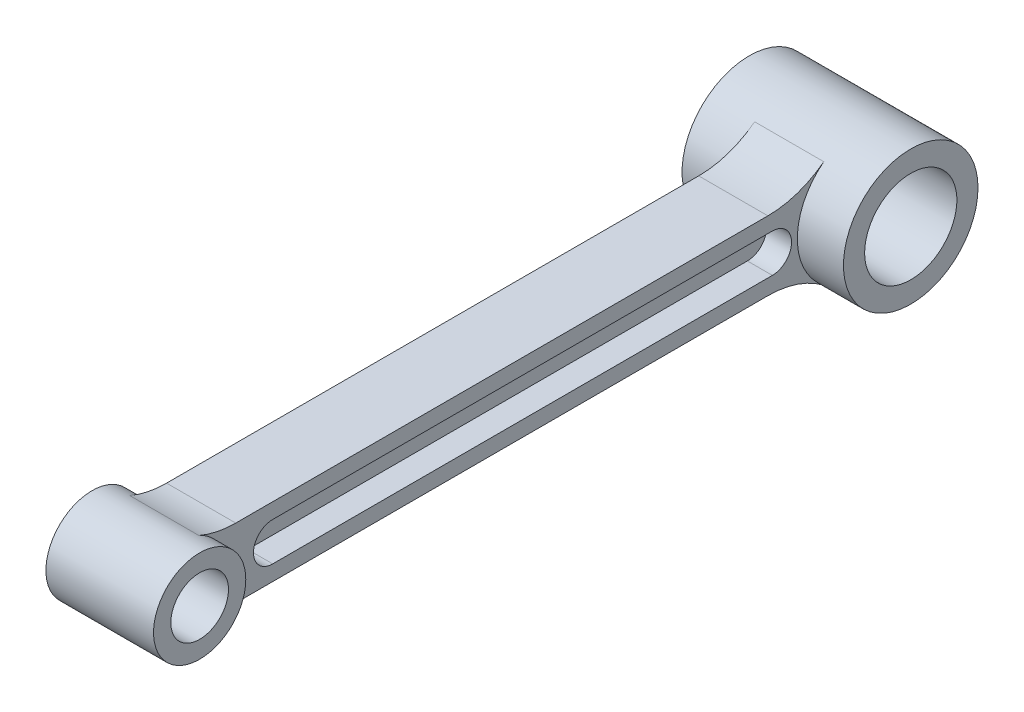
ISO-10303-21;
HEADER;
FILE_DESCRIPTION(('STEP AP214'),'2;1');
FILE_NAME('part.step','',(''),(''),'','','');
FILE_SCHEMA(('AUTOMOTIVE_DESIGN { 1 0 10303 214 1 1 1 1 }'));
ENDSEC;
DATA;
#1=APPLICATION_CONTEXT('core data for automotive mechanical design processes');
#2=APPLICATION_PROTOCOL_DEFINITION('international standard','automotive_design',2000,#1);
#3=PRODUCT_CONTEXT('',#1,'mechanical');
#4=PRODUCT('Part','Part','',(#3));
#5=PRODUCT_RELATED_PRODUCT_CATEGORY('part','',(#4));
#6=PRODUCT_DEFINITION_FORMATION('','',#4);
#7=PRODUCT_DEFINITION_CONTEXT('part definition',#1,'design');
#8=PRODUCT_DEFINITION('design','',#6,#7);
#9=PRODUCT_DEFINITION_SHAPE('','',#8);
#10=(LENGTH_UNIT() NAMED_UNIT(*) SI_UNIT(.MILLI.,.METRE.));
#11=(NAMED_UNIT(*) PLANE_ANGLE_UNIT() SI_UNIT($,.RADIAN.));
#12=(NAMED_UNIT(*) SI_UNIT($,.STERADIAN.) SOLID_ANGLE_UNIT());
#13=UNCERTAINTY_MEASURE_WITH_UNIT(LENGTH_MEASURE(1.E-05),#10,'distance_accuracy_value','');
#14=(GEOMETRIC_REPRESENTATION_CONTEXT(3) GLOBAL_UNCERTAINTY_ASSIGNED_CONTEXT((#13)) GLOBAL_UNIT_ASSIGNED_CONTEXT((#10,
#11,#12)) REPRESENTATION_CONTEXT('',''));
#15=CARTESIAN_POINT('',(0.,0.,0.));
#16=DIRECTION('',(0.,0.,1.));
#17=DIRECTION('',(1.,0.,0.));
#18=AXIS2_PLACEMENT_3D('',#15,#16,#17);
#19=CARTESIAN_POINT('',(2.5,0.,0.));
#20=DIRECTION('',(1.,0.,0.));
#21=DIRECTION('',(0.,0.,-1.));
#22=AXIS2_PLACEMENT_3D('',#19,#20,#21);
#23=PLANE('',#22);
#24=DIRECTION('',(0.,0.,-1.));
#25=VECTOR('',#24,1.);
#26=CARTESIAN_POINT('',(2.5,-5.,0.));
#27=LINE('',#26,#25);
#28=CARTESIAN_POINT('',(2.5,-5.,0.));
#29=VERTEX_POINT('',#28);
#30=CARTESIAN_POINT('',(2.5,-5.,-130.));
#31=VERTEX_POINT('',#30);
#32=EDGE_CURVE('E245',#29,#31,#27,.T.);
#33=ORIENTED_EDGE('',*,*,#32,.T.);
#34=CARTESIAN_POINT('',(2.5,0.,-130.));
#35=DIRECTION('',(1.,0.,0.));
#36=DIRECTION('',(0.,0.,-1.));
#37=AXIS2_PLACEMENT_3D('',#34,#35,#36);
#38=CIRCLE('',#37,5.);
#39=CARTESIAN_POINT('',(2.5,5.,-130.));
#40=VERTEX_POINT('',#39);
#41=EDGE_CURVE('E248',#31,#40,#38,.T.);
#42=ORIENTED_EDGE('',*,*,#41,.T.);
#43=DIRECTION('',(0.,0.,-1.));
#44=VECTOR('',#43,1.);
#45=CARTESIAN_POINT('',(2.5,5.,0.));
#46=LINE('',#45,#44);
#47=CARTESIAN_POINT('',(2.5,5.,0.));
#48=VERTEX_POINT('',#47);
#49=EDGE_CURVE('E50',#48,#40,#46,.T.);
#50=ORIENTED_EDGE('',*,*,#49,.F.);
#51=CARTESIAN_POINT('',(2.5,0.,0.));
#52=DIRECTION('',(1.,0.,0.));
#53=DIRECTION('',(0.,0.,-1.));
#54=AXIS2_PLACEMENT_3D('',#51,#52,#53);
#55=CIRCLE('',#54,5.);
#56=EDGE_CURVE('E11',#48,#29,#55,.T.);
#57=ORIENTED_EDGE('',*,*,#56,.T.);
#58=EDGE_LOOP('',(#33,#42,#50,#57));
#59=FACE_BOUND('',#58,.T.);
#60=ADVANCED_FACE('F39',(#59),#23,.T.);
#61=CARTESIAN_POINT('',(9.,0.,-130.));
#62=DIRECTION('',(-1.,0.,0.));
#63=DIRECTION('',(0.,0.,1.));
#64=AXIS2_PLACEMENT_3D('',#61,#62,#63);
#65=CYLINDRICAL_SURFACE('',#64,5.);
#66=CARTESIAN_POINT('',(-2.5,0.,-130.));
#67=DIRECTION('',(1.,0.,0.));
#68=DIRECTION('',(0.,0.,-1.));
#69=AXIS2_PLACEMENT_3D('',#66,#67,#68);
#70=CIRCLE('',#69,5.);
#71=CARTESIAN_POINT('',(-2.5,-5.,-130.));
#72=VERTEX_POINT('',#71);
#73=CARTESIAN_POINT('',(-2.5,5.,-130.));
#74=VERTEX_POINT('',#73);
#75=EDGE_CURVE('E256',#72,#74,#70,.T.);
#76=ORIENTED_EDGE('',*,*,#75,.T.);
#77=DIRECTION('',(-1.,0.,0.));
#78=VECTOR('',#77,1.);
#79=CARTESIAN_POINT('',(9.,5.,-130.));
#80=LINE('',#79,#78);
#81=CARTESIAN_POINT('',(-9.,5.,-130.));
#82=VERTEX_POINT('',#81);
#83=EDGE_CURVE('E231',#74,#82,#80,.T.);
#84=ORIENTED_EDGE('',*,*,#83,.T.);
#85=CARTESIAN_POINT('',(-9.,0.,-130.));
#86=DIRECTION('',(1.,0.,0.));
#87=DIRECTION('',(0.,0.,-1.));
#88=AXIS2_PLACEMENT_3D('',#85,#86,#87);
#89=CIRCLE('',#88,5.);
#90=CARTESIAN_POINT('',(-9.,-5.,-130.));
#91=VERTEX_POINT('',#90);
#92=EDGE_CURVE('E303',#91,#82,#89,.T.);
#93=ORIENTED_EDGE('',*,*,#92,.F.);
#94=DIRECTION('',(-1.,0.,0.));
#95=VECTOR('',#94,1.);
#96=CARTESIAN_POINT('',(9.,-5.,-130.));
#97=LINE('',#96,#95);
#98=EDGE_CURVE('E241',#72,#91,#97,.T.);
#99=ORIENTED_EDGE('',*,*,#98,.F.);
#100=EDGE_LOOP('',(#76,#84,#93,#99));
#101=FACE_BOUND('',#100,.T.);
#102=ADVANCED_FACE('F281',(#101),#65,.F.);
#103=CARTESIAN_POINT('',(9.,-5.,0.));
#104=DIRECTION('',(0.,1.,0.));
#105=DIRECTION('',(0.,0.,1.));
#106=AXIS2_PLACEMENT_3D('',#103,#104,#105);
#107=PLANE('',#106);
#108=DIRECTION('',(0.,0.,-1.));
#109=VECTOR('',#108,1.);
#110=CARTESIAN_POINT('',(-2.5,-5.,0.));
#111=LINE('',#110,#109);
#112=CARTESIAN_POINT('',(-2.5,-5.,0.));
#113=VERTEX_POINT('',#112);
#114=EDGE_CURVE('E171',#113,#72,#111,.T.);
#115=ORIENTED_EDGE('',*,*,#114,.T.);
#116=ORIENTED_EDGE('',*,*,#98,.T.);
#117=DIRECTION('',(0.,0.,-1.));
#118=VECTOR('',#117,1.);
#119=CARTESIAN_POINT('',(-9.,-5.,0.));
#120=LINE('',#119,#118);
#121=CARTESIAN_POINT('',(-9.,-5.,0.));
#122=VERTEX_POINT('',#121);
#123=EDGE_CURVE('E277',#122,#91,#120,.T.);
#124=ORIENTED_EDGE('',*,*,#123,.F.);
#125=DIRECTION('',(-1.,0.,0.));
#126=VECTOR('',#125,1.);
#127=CARTESIAN_POINT('',(9.,-5.,0.));
#128=LINE('',#127,#126);
#129=EDGE_CURVE('E236',#113,#122,#128,.T.);
#130=ORIENTED_EDGE('',*,*,#129,.F.);
#131=EDGE_LOOP('',(#115,#116,#124,#130));
#132=FACE_BOUND('',#131,.T.);
#133=ADVANCED_FACE('F274',(#132),#107,.T.);
#134=CARTESIAN_POINT('',(9.,0.,0.));
#135=DIRECTION('',(-1.,0.,0.));
#136=DIRECTION('',(0.,0.,1.));
#137=AXIS2_PLACEMENT_3D('',#134,#135,#136);
#138=CYLINDRICAL_SURFACE('',#137,5.);
#139=CARTESIAN_POINT('',(-2.5,0.,0.));
#140=DIRECTION('',(1.,0.,0.));
#141=DIRECTION('',(0.,0.,-1.));
#142=AXIS2_PLACEMENT_3D('',#139,#140,#141);
#143=CIRCLE('',#142,5.);
#144=CARTESIAN_POINT('',(-2.5,5.,0.));
#145=VERTEX_POINT('',#144);
#146=EDGE_CURVE('E43',#145,#113,#143,.T.);
#147=ORIENTED_EDGE('',*,*,#146,.T.);
#148=ORIENTED_EDGE('',*,*,#129,.T.);
#149=CARTESIAN_POINT('',(-9.,0.,0.));
#150=DIRECTION('',(1.,0.,0.));
#151=DIRECTION('',(0.,0.,-1.));
#152=AXIS2_PLACEMENT_3D('',#149,#150,#151);
#153=CIRCLE('',#152,5.);
#154=CARTESIAN_POINT('',(-9.,5.,0.));
#155=VERTEX_POINT('',#154);
#156=EDGE_CURVE('E309',#155,#122,#153,.T.);
#157=ORIENTED_EDGE('',*,*,#156,.F.);
#158=DIRECTION('',(-1.,0.,0.));
#159=VECTOR('',#158,1.);
#160=CARTESIAN_POINT('',(9.,5.,0.));
#161=LINE('',#160,#159);
#162=EDGE_CURVE('E230',#145,#155,#161,.T.);
#163=ORIENTED_EDGE('',*,*,#162,.F.);
#164=EDGE_LOOP('',(#147,#148,#157,#163));
#165=FACE_BOUND('',#164,.T.);
#166=ADVANCED_FACE('F269',(#165),#138,.F.);
#167=CARTESIAN_POINT('',(9.,5.,0.));
#168=DIRECTION('',(0.,1.,0.));
#169=DIRECTION('',(0.,0.,1.));
#170=AXIS2_PLACEMENT_3D('',#167,#168,#169);
#171=PLANE('',#170);
#172=ORIENTED_EDGE('',*,*,#83,.F.);
#173=DIRECTION('',(0.,0.,-1.));
#174=VECTOR('',#173,1.);
#175=CARTESIAN_POINT('',(-2.5,5.,0.));
#176=LINE('',#175,#174);
#177=EDGE_CURVE('E259',#145,#74,#176,.T.);
#178=ORIENTED_EDGE('',*,*,#177,.F.);
#179=ORIENTED_EDGE('',*,*,#162,.T.);
#180=DIRECTION('',(0.,0.,-1.));
#181=VECTOR('',#180,1.);
#182=CARTESIAN_POINT('',(-9.,5.,0.));
#183=LINE('',#182,#181);
#184=EDGE_CURVE('E161',#155,#82,#183,.T.);
#185=ORIENTED_EDGE('',*,*,#184,.T.);
#186=EDGE_LOOP('',(#172,#178,#179,#185));
#187=FACE_BOUND('',#186,.T.);
#188=ADVANCED_FACE('F286',(#187),#171,.F.);
#189=CARTESIAN_POINT('',(9.,-33.,9.61250543006183));
#190=DIRECTION('',(-1.,0.,0.));
#191=DIRECTION('',(0.,0.,1.));
#192=AXIS2_PLACEMENT_3D('',#189,#190,#191);
#193=CYLINDRICAL_SURFACE('',#192,24.);
#194=CARTESIAN_POINT('',(-9.,-33.,9.61250543006183));
#195=DIRECTION('',(1.,0.,0.));
#196=DIRECTION('',(0.,0.,-1.));
#197=AXIS2_PLACEMENT_3D('',#194,#195,#196);
#198=CIRCLE('',#197,24.);
#199=CARTESIAN_POINT('',(-9.,-11.,19.2041684766873));
#200=VERTEX_POINT('',#199);
#201=CARTESIAN_POINT('',(-9.,-9.,9.61250543006183));
#202=VERTEX_POINT('',#201);
#203=EDGE_CURVE('E160',#200,#202,#198,.F.);
#204=ORIENTED_EDGE('',*,*,#203,.T.);
#205=DIRECTION('',(-1.,0.,0.));
#206=VECTOR('',#205,1.);
#207=CARTESIAN_POINT('',(9.,-9.,9.61250543006183));
#208=LINE('',#207,#206);
#209=CARTESIAN_POINT('',(9.,-9.,9.61250543006183));
#210=VERTEX_POINT('',#209);
#211=EDGE_CURVE('E172',#210,#202,#208,.T.);
#212=ORIENTED_EDGE('',*,*,#211,.F.);
#213=CARTESIAN_POINT('',(9.,-33.,9.61250543006183));
#214=DIRECTION('',(1.,0.,0.));
#215=DIRECTION('',(0.,0.,-1.));
#216=AXIS2_PLACEMENT_3D('',#213,#214,#215);
#217=CIRCLE('',#216,24.);
#218=CARTESIAN_POINT('',(9.,-11.,19.2041684766873));
#219=VERTEX_POINT('',#218);
#220=EDGE_CURVE('E168',#219,#210,#217,.F.);
#221=ORIENTED_EDGE('',*,*,#220,.F.);
#222=DIRECTION('',(-1.,0.,0.));
#223=VECTOR('',#222,1.);
#224=CARTESIAN_POINT('',(9.,-11.,19.2041684766873));
#225=LINE('',#224,#223);
#226=EDGE_CURVE('E151',#219,#200,#225,.T.);
#227=ORIENTED_EDGE('',*,*,#226,.T.);
#228=EDGE_LOOP('',(#204,#212,#221,#227));
#229=FACE_BOUND('',#228,.T.);
#230=ADVANCED_FACE('F165',(#229),#193,.F.);
#231=CARTESIAN_POINT('',(9.,-9.,0.));
#232=DIRECTION('',(0.,1.,0.));
#233=DIRECTION('',(0.,0.,1.));
#234=AXIS2_PLACEMENT_3D('',#231,#232,#233);
#235=PLANE('',#234);
#236=DIRECTION('',(0.,0.,-1.));
#237=VECTOR('',#236,1.);
#238=CARTESIAN_POINT('',(-9.,-9.,0.));
#239=LINE('',#238,#237);
#240=CARTESIAN_POINT('',(-9.,-9.,-128.835540935677));
#241=VERTEX_POINT('',#240);
#242=EDGE_CURVE('E176',#202,#241,#239,.T.);
#243=ORIENTED_EDGE('',*,*,#242,.T.);
#244=DIRECTION('',(-1.,0.,0.));
#245=VECTOR('',#244,1.);
#246=CARTESIAN_POINT('',(9.,-9.,-128.835540935677));
#247=LINE('',#246,#245);
#248=CARTESIAN_POINT('',(9.,-9.,-128.835540935677));
#249=VERTEX_POINT('',#248);
#250=EDGE_CURVE('E220',#249,#241,#247,.T.);
#251=ORIENTED_EDGE('',*,*,#250,.F.);
#252=DIRECTION('',(0.,0.,-1.));
#253=VECTOR('',#252,1.);
#254=CARTESIAN_POINT('',(9.,-9.,0.));
#255=LINE('',#254,#253);
#256=EDGE_CURVE('E365',#210,#249,#255,.T.);
#257=ORIENTED_EDGE('',*,*,#256,.F.);
#258=ORIENTED_EDGE('',*,*,#211,.T.);
#259=EDGE_LOOP('',(#243,#251,#257,#258));
#260=FACE_BOUND('',#259,.T.);
#261=ADVANCED_FACE('F397',(#260),#235,.F.);
#262=CARTESIAN_POINT('',(9.,-33.,-128.835540935677));
#263=DIRECTION('',(-1.,0.,0.));
#264=DIRECTION('',(0.,0.,1.));
#265=AXIS2_PLACEMENT_3D('',#262,#263,#264);
#266=CYLINDRICAL_SURFACE('',#265,24.);
#267=CARTESIAN_POINT('',(-9.,-33.,-128.835540935677));
#268=DIRECTION('',(1.,0.,0.));
#269=DIRECTION('',(0.,0.,-1.));
#270=AXIS2_PLACEMENT_3D('',#267,#268,#269);
#271=CIRCLE('',#270,24.);
#272=CARTESIAN_POINT('',(-9.,-13.9156626506024,-143.388481117454));
#273=VERTEX_POINT('',#272);
#274=EDGE_CURVE('E181',#241,#273,#271,.F.);
#275=ORIENTED_EDGE('',*,*,#274,.T.);
#276=DIRECTION('',(-1.,0.,0.));
#277=VECTOR('',#276,1.);
#278=CARTESIAN_POINT('',(9.,-13.9156626506024,-143.388481117454));
#279=LINE('',#278,#277);
#280=CARTESIAN_POINT('',(9.,-13.9156626506024,-143.388481117454));
#281=VERTEX_POINT('',#280);
#282=EDGE_CURVE('E217',#281,#273,#279,.T.);
#283=ORIENTED_EDGE('',*,*,#282,.F.);
#284=CARTESIAN_POINT('',(9.,-33.,-128.835540935677));
#285=DIRECTION('',(1.,0.,0.));
#286=DIRECTION('',(0.,0.,-1.));
#287=AXIS2_PLACEMENT_3D('',#284,#285,#286);
#288=CIRCLE('',#287,24.);
#289=EDGE_CURVE('E369',#249,#281,#288,.F.);
#290=ORIENTED_EDGE('',*,*,#289,.F.);
#291=ORIENTED_EDGE('',*,*,#250,.T.);
#292=EDGE_LOOP('',(#275,#283,#290,#291));
#293=FACE_BOUND('',#292,.T.);
#294=ADVANCED_FACE('F394',(#293),#266,.F.);
#295=CARTESIAN_POINT('',(9.,33.,-128.835540935677));
#296=DIRECTION('',(-1.,0.,0.));
#297=DIRECTION('',(0.,0.,1.));
#298=AXIS2_PLACEMENT_3D('',#295,#296,#297);
#299=CYLINDRICAL_SURFACE('',#298,24.);
#300=CARTESIAN_POINT('',(-9.,33.,-128.835540935677));
#301=DIRECTION('',(1.,0.,0.));
#302=DIRECTION('',(0.,0.,-1.));
#303=AXIS2_PLACEMENT_3D('',#300,#301,#302);
#304=CIRCLE('',#303,24.);
#305=CARTESIAN_POINT('',(-9.,9.00000000000001,-128.835540935677));
#306=VERTEX_POINT('',#305);
#307=CARTESIAN_POINT('',(-9.,13.9156626506024,-143.388481117454));
#308=VERTEX_POINT('',#307);
#309=EDGE_CURVE('E192',#306,#308,#304,.T.);
#310=ORIENTED_EDGE('',*,*,#309,.F.);
#311=DIRECTION('',(-1.,0.,0.));
#312=VECTOR('',#311,1.);
#313=CARTESIAN_POINT('',(9.,9.00000000000001,-128.835540935677));
#314=LINE('',#313,#312);
#315=CARTESIAN_POINT('',(9.,9.00000000000001,-128.835540935677));
#316=VERTEX_POINT('',#315);
#317=EDGE_CURVE('E210',#316,#306,#314,.T.);
#318=ORIENTED_EDGE('',*,*,#317,.F.);
#319=CARTESIAN_POINT('',(9.,33.,-128.835540935677));
#320=DIRECTION('',(1.,0.,0.));
#321=DIRECTION('',(0.,0.,-1.));
#322=AXIS2_PLACEMENT_3D('',#319,#320,#321);
#323=CIRCLE('',#322,24.);
#324=CARTESIAN_POINT('',(9.,13.9156626506024,-143.388481117454));
#325=VERTEX_POINT('',#324);
#326=EDGE_CURVE('E299',#316,#325,#323,.T.);
#327=ORIENTED_EDGE('',*,*,#326,.T.);
#328=DIRECTION('',(-1.,0.,0.));
#329=VECTOR('',#328,1.);
#330=CARTESIAN_POINT('',(9.,13.9156626506024,-143.388481117454));
#331=LINE('',#330,#329);
#332=EDGE_CURVE('E213',#325,#308,#331,.T.);
#333=ORIENTED_EDGE('',*,*,#332,.T.);
#334=EDGE_LOOP('',(#310,#318,#327,#333));
#335=FACE_BOUND('',#334,.T.);
#336=ADVANCED_FACE('F380',(#335),#299,.F.);
#337=CARTESIAN_POINT('',(9.,9.,0.));
#338=DIRECTION('',(0.,1.,0.));
#339=DIRECTION('',(0.,0.,1.));
#340=AXIS2_PLACEMENT_3D('',#337,#338,#339);
#341=PLANE('',#340);
#342=DIRECTION('',(0.,0.,-1.));
#343=VECTOR('',#342,1.);
#344=CARTESIAN_POINT('',(-9.,9.,0.));
#345=LINE('',#344,#343);
#346=CARTESIAN_POINT('',(-9.,9.,9.61250543006183));
#347=VERTEX_POINT('',#346);
#348=EDGE_CURVE('E196',#347,#306,#345,.T.);
#349=ORIENTED_EDGE('',*,*,#348,.F.);
#350=DIRECTION('',(-1.,0.,0.));
#351=VECTOR('',#350,1.);
#352=CARTESIAN_POINT('',(9.,9.,9.61250543006183));
#353=LINE('',#352,#351);
#354=CARTESIAN_POINT('',(9.,9.,9.61250543006183));
#355=VERTEX_POINT('',#354);
#356=EDGE_CURVE('E206',#355,#347,#353,.T.);
#357=ORIENTED_EDGE('',*,*,#356,.F.);
#358=DIRECTION('',(0.,0.,-1.));
#359=VECTOR('',#358,1.);
#360=CARTESIAN_POINT('',(9.,9.,0.));
#361=LINE('',#360,#359);
#362=EDGE_CURVE('E293',#355,#316,#361,.T.);
#363=ORIENTED_EDGE('',*,*,#362,.T.);
#364=ORIENTED_EDGE('',*,*,#317,.T.);
#365=EDGE_LOOP('',(#349,#357,#363,#364));
#366=FACE_BOUND('',#365,.T.);
#367=ADVANCED_FACE('F387',(#366),#341,.T.);
#368=CARTESIAN_POINT('',(9.,5.,-130.));
#369=VERTEX_POINT('',#368);
#370=EDGE_CURVE('E226',#369,#40,#80,.T.);
#371=ORIENTED_EDGE('',*,*,#370,.T.);
#372=ORIENTED_EDGE('',*,*,#41,.F.);
#373=CARTESIAN_POINT('',(9.,-5.,-130.));
#374=VERTEX_POINT('',#373);
#375=EDGE_CURVE('E207',#374,#31,#97,.T.);
#376=ORIENTED_EDGE('',*,*,#375,.F.);
#377=CARTESIAN_POINT('',(9.,0.,-130.));
#378=DIRECTION('',(1.,0.,0.));
#379=DIRECTION('',(0.,0.,-1.));
#380=AXIS2_PLACEMENT_3D('',#377,#378,#379);
#381=CIRCLE('',#380,5.);
#382=EDGE_CURVE('E203',#374,#369,#381,.T.);
#383=ORIENTED_EDGE('',*,*,#382,.T.);
#384=EDGE_LOOP('',(#371,#372,#376,#383));
#385=FACE_BOUND('',#384,.T.);
#386=ADVANCED_FACE('F411',(#385),#65,.F.);
#387=ORIENTED_EDGE('',*,*,#375,.T.);
#388=ORIENTED_EDGE('',*,*,#32,.F.);
#389=CARTESIAN_POINT('',(9.,-5.,0.));
#390=VERTEX_POINT('',#389);
#391=EDGE_CURVE('E237',#390,#29,#128,.T.);
#392=ORIENTED_EDGE('',*,*,#391,.F.);
#393=DIRECTION('',(0.,0.,-1.));
#394=VECTOR('',#393,1.);
#395=CARTESIAN_POINT('',(9.,-5.,0.));
#396=LINE('',#395,#394);
#397=EDGE_CURVE('E349',#390,#374,#396,.T.);
#398=ORIENTED_EDGE('',*,*,#397,.T.);
#399=EDGE_LOOP('',(#387,#388,#392,#398));
#400=FACE_BOUND('',#399,.T.);
#401=ADVANCED_FACE('F414',(#400),#107,.T.);
#402=ORIENTED_EDGE('',*,*,#391,.T.);
#403=ORIENTED_EDGE('',*,*,#56,.F.);
#404=CARTESIAN_POINT('',(9.,5.,0.));
#405=VERTEX_POINT('',#404);
#406=EDGE_CURVE('E232',#405,#48,#161,.T.);
#407=ORIENTED_EDGE('',*,*,#406,.F.);
#408=CARTESIAN_POINT('',(9.,0.,0.));
#409=DIRECTION('',(1.,0.,0.));
#410=DIRECTION('',(0.,0.,-1.));
#411=AXIS2_PLACEMENT_3D('',#408,#409,#410);
#412=CIRCLE('',#411,5.);
#413=EDGE_CURVE('E353',#405,#390,#412,.T.);
#414=ORIENTED_EDGE('',*,*,#413,.T.);
#415=EDGE_LOOP('',(#402,#403,#407,#414));
#416=FACE_BOUND('',#415,.T.);
#417=ADVANCED_FACE('F418',(#416),#138,.F.);
#418=ORIENTED_EDGE('',*,*,#49,.T.);
#419=ORIENTED_EDGE('',*,*,#370,.F.);
#420=DIRECTION('',(0.,0.,-1.));
#421=VECTOR('',#420,1.);
#422=CARTESIAN_POINT('',(9.,5.,0.));
#423=LINE('',#422,#421);
#424=EDGE_CURVE('E357',#405,#369,#423,.T.);
#425=ORIENTED_EDGE('',*,*,#424,.F.);
#426=ORIENTED_EDGE('',*,*,#406,.T.);
#427=EDGE_LOOP('',(#418,#419,#425,#426));
#428=FACE_BOUND('',#427,.T.);
#429=ADVANCED_FACE('F422',(#428),#171,.F.);
#430=CARTESIAN_POINT('',(9.,33.,9.61250543006183));
#431=DIRECTION('',(-1.,0.,0.));
#432=DIRECTION('',(0.,0.,1.));
#433=AXIS2_PLACEMENT_3D('',#430,#431,#432);
#434=CYLINDRICAL_SURFACE('',#433,24.);
#435=CARTESIAN_POINT('',(-9.,33.,9.61250543006183));
#436=DIRECTION('',(1.,0.,0.));
#437=DIRECTION('',(0.,0.,-1.));
#438=AXIS2_PLACEMENT_3D('',#435,#436,#437);
#439=CIRCLE('',#438,24.);
#440=CARTESIAN_POINT('',(-9.,11.,19.2041684766873));
#441=VERTEX_POINT('',#440);
#442=EDGE_CURVE('E200',#441,#347,#439,.T.);
#443=ORIENTED_EDGE('',*,*,#442,.F.);
#444=DIRECTION('',(-1.,0.,0.));
#445=VECTOR('',#444,1.);
#446=CARTESIAN_POINT('',(9.,11.,19.2041684766873));
#447=LINE('',#446,#445);
#448=CARTESIAN_POINT('',(9.,11.,19.2041684766873));
#449=VERTEX_POINT('',#448);
#450=EDGE_CURVE('E154',#449,#441,#447,.T.);
#451=ORIENTED_EDGE('',*,*,#450,.F.);
#452=CARTESIAN_POINT('',(9.,33.,9.61250543006183));
#453=DIRECTION('',(1.,0.,0.));
#454=DIRECTION('',(0.,0.,-1.));
#455=AXIS2_PLACEMENT_3D('',#452,#453,#454);
#456=CIRCLE('',#455,24.);
#457=EDGE_CURVE('E290',#449,#355,#456,.T.);
#458=ORIENTED_EDGE('',*,*,#457,.T.);
#459=ORIENTED_EDGE('',*,*,#356,.T.);
#460=EDGE_LOOP('',(#443,#451,#458,#459));
#461=FACE_BOUND('',#460,.T.);
#462=ADVANCED_FACE('F388',(#461),#434,.F.);
#463=CARTESIAN_POINT('',(9.,0.,0.));
#464=DIRECTION('',(1.,0.,0.));
#465=DIRECTION('',(0.,0.,-1.));
#466=AXIS2_PLACEMENT_3D('',#463,#464,#465);
#467=PLANE('',#466);
#468=ORIENTED_EDGE('',*,*,#382,.F.);
#469=ORIENTED_EDGE('',*,*,#397,.F.);
#470=ORIENTED_EDGE('',*,*,#413,.F.);
#471=ORIENTED_EDGE('',*,*,#424,.T.);
#472=EDGE_LOOP('',(#468,#469,#470,#471));
#473=FACE_BOUND('',#472,.T.);
#474=CARTESIAN_POINT('',(9.,0.,24.));
#475=DIRECTION('',(1.,0.,0.));
#476=DIRECTION('',(0.,0.,-1.));
#477=AXIS2_PLACEMENT_3D('',#474,#475,#476);
#478=CIRCLE('',#477,12.);
#479=EDGE_CURVE('E360',#219,#449,#478,.T.);
#480=ORIENTED_EDGE('',*,*,#479,.F.);
#481=ORIENTED_EDGE('',*,*,#220,.T.);
#482=ORIENTED_EDGE('',*,*,#256,.T.);
#483=ORIENTED_EDGE('',*,*,#289,.T.);
#484=CARTESIAN_POINT('',(9.,0.,-154.));
#485=DIRECTION('',(1.,0.,0.));
#486=DIRECTION('',(0.,0.,-1.));
#487=AXIS2_PLACEMENT_3D('',#484,#485,#486);
#488=CIRCLE('',#487,17.5);
#489=EDGE_CURVE('E373',#325,#281,#488,.T.);
#490=ORIENTED_EDGE('',*,*,#489,.F.);
#491=ORIENTED_EDGE('',*,*,#326,.F.);
#492=ORIENTED_EDGE('',*,*,#362,.F.);
#493=ORIENTED_EDGE('',*,*,#457,.F.);
#494=EDGE_LOOP('',(#480,#481,#482,#483,#490,#491,#492,#493));
#495=FACE_BOUND('',#494,.T.);
#496=ADVANCED_FACE('F384',(#473,#495),#467,.T.);
#497=CARTESIAN_POINT('',(-9.,0.,0.));
#498=DIRECTION('',(1.,0.,0.));
#499=DIRECTION('',(0.,0.,-1.));
#500=AXIS2_PLACEMENT_3D('',#497,#498,#499);
#501=PLANE('',#500);
#502=ORIENTED_EDGE('',*,*,#92,.T.);
#503=ORIENTED_EDGE('',*,*,#184,.F.);
#504=ORIENTED_EDGE('',*,*,#156,.T.);
#505=ORIENTED_EDGE('',*,*,#123,.T.);
#506=EDGE_LOOP('',(#502,#503,#504,#505));
#507=FACE_BOUND('',#506,.T.);
#508=CARTESIAN_POINT('',(-9.,0.,24.));
#509=DIRECTION('',(1.,0.,0.));
#510=DIRECTION('',(0.,0.,-1.));
#511=AXIS2_PLACEMENT_3D('',#508,#509,#510);
#512=CIRCLE('',#511,12.);
#513=EDGE_CURVE('E147',#200,#441,#512,.T.);
#514=ORIENTED_EDGE('',*,*,#513,.T.);
#515=ORIENTED_EDGE('',*,*,#442,.T.);
#516=ORIENTED_EDGE('',*,*,#348,.T.);
#517=ORIENTED_EDGE('',*,*,#309,.T.);
#518=CARTESIAN_POINT('',(-9.,0.,-154.));
#519=DIRECTION('',(1.,0.,0.));
#520=DIRECTION('',(0.,0.,-1.));
#521=AXIS2_PLACEMENT_3D('',#518,#519,#520);
#522=CIRCLE('',#521,17.5);
#523=EDGE_CURVE('E188',#308,#273,#522,.T.);
#524=ORIENTED_EDGE('',*,*,#523,.T.);
#525=ORIENTED_EDGE('',*,*,#274,.F.);
#526=ORIENTED_EDGE('',*,*,#242,.F.);
#527=ORIENTED_EDGE('',*,*,#203,.F.);
#528=EDGE_LOOP('',(#514,#515,#516,#517,#524,#525,#526,#527));
#529=FACE_BOUND('',#528,.T.);
#530=ADVANCED_FACE('F174',(#507,#529),#501,.F.);
#531=CARTESIAN_POINT('',(-2.5,0.,0.));
#532=DIRECTION('',(1.,0.,0.));
#533=DIRECTION('',(0.,0.,-1.));
#534=AXIS2_PLACEMENT_3D('',#531,#532,#533);
#535=PLANE('',#534);
#536=ORIENTED_EDGE('',*,*,#114,.F.);
#537=ORIENTED_EDGE('',*,*,#146,.F.);
#538=ORIENTED_EDGE('',*,*,#177,.T.);
#539=ORIENTED_EDGE('',*,*,#75,.F.);
#540=EDGE_LOOP('',(#536,#537,#538,#539));
#541=FACE_BOUND('',#540,.T.);
#542=ADVANCED_FACE('F41',(#541),#535,.F.);
#543=CARTESIAN_POINT('',(21.,0.,-154.));
#544=DIRECTION('',(-1.,0.,0.));
#545=DIRECTION('',(0.,0.,1.));
#546=AXIS2_PLACEMENT_3D('',#543,#544,#545);
#547=CYLINDRICAL_SURFACE('',#546,12.);
#548=CARTESIAN_POINT('',(21.,0.,-154.));
#549=DIRECTION('',(1.,0.,0.));
#550=DIRECTION('',(0.,0.,-1.));
#551=AXIS2_PLACEMENT_3D('',#548,#549,#550);
#552=CIRCLE('',#551,12.);
#553=CARTESIAN_POINT('',(21.,0.,-142.));
#554=VERTEX_POINT('',#553);
#555=EDGE_CURVE('E315',#554,#554,#552,.T.);
#556=CARTESIAN_POINT('',(-21.,0.,-154.));
#557=DIRECTION('',(1.,0.,0.));
#558=DIRECTION('',(0.,0.,-1.));
#559=AXIS2_PLACEMENT_3D('',#556,#557,#558);
#560=CIRCLE('',#559,12.);
#561=CARTESIAN_POINT('',(-21.,0.,-142.));
#562=VERTEX_POINT('',#561);
#563=EDGE_CURVE('E323',#562,#562,#560,.T.);
#564=CARTESIAN_POINT('',(21.,0.,-142.));
#565=CARTESIAN_POINT('',(20.5625,0.,-142.));
#566=CARTESIAN_POINT('',(20.125,0.,-142.));
#567=CARTESIAN_POINT('',(19.25,0.,-142.));
#568=CARTESIAN_POINT('',(18.8125,0.,-142.));
#569=CARTESIAN_POINT('',(17.9375,0.,-142.));
#570=CARTESIAN_POINT('',(17.5,0.,-142.));
#571=CARTESIAN_POINT('',(16.625,0.,-142.));
#572=CARTESIAN_POINT('',(16.1875,0.,-142.));
#573=CARTESIAN_POINT('',(15.3125,0.,-142.));
#574=CARTESIAN_POINT('',(14.875,0.,-142.));
#575=CARTESIAN_POINT('',(14.,0.,-142.));
#576=CARTESIAN_POINT('',(13.5625,0.,-142.));
#577=CARTESIAN_POINT('',(12.6875,0.,-142.));
#578=CARTESIAN_POINT('',(12.25,0.,-142.));
#579=CARTESIAN_POINT('',(11.375,0.,-142.));
#580=CARTESIAN_POINT('',(10.9375,0.,-142.));
#581=CARTESIAN_POINT('',(10.0625,0.,-142.));
#582=CARTESIAN_POINT('',(9.625,0.,-142.));
#583=CARTESIAN_POINT('',(8.75,0.,-142.));
#584=CARTESIAN_POINT('',(8.3125,0.,-142.));
#585=CARTESIAN_POINT('',(7.4375,0.,-142.));
#586=CARTESIAN_POINT('',(7.,0.,-142.));
#587=CARTESIAN_POINT('',(6.125,0.,-142.));
#588=CARTESIAN_POINT('',(5.6875,0.,-142.));
#589=CARTESIAN_POINT('',(4.8125,0.,-142.));
#590=CARTESIAN_POINT('',(4.375,0.,-142.));
#591=CARTESIAN_POINT('',(3.5,0.,-142.));
#592=CARTESIAN_POINT('',(3.0625,0.,-142.));
#593=CARTESIAN_POINT('',(2.1875,0.,-142.));
#594=CARTESIAN_POINT('',(1.75,0.,-142.));
#595=CARTESIAN_POINT('',(0.874999999999997,0.,-142.));
#596=CARTESIAN_POINT('',(0.437499999999997,0.,-142.));
#597=CARTESIAN_POINT('',(-0.437500000000004,0.,-142.));
#598=CARTESIAN_POINT('',(-0.875000000000004,0.,-142.));
#599=CARTESIAN_POINT('',(-1.75000000000001,0.,-142.));
#600=CARTESIAN_POINT('',(-2.18750000000001,0.,-142.));
#601=CARTESIAN_POINT('',(-3.0625,0.,-142.));
#602=CARTESIAN_POINT('',(-3.5,0.,-142.));
#603=CARTESIAN_POINT('',(-4.375,0.,-142.));
#604=CARTESIAN_POINT('',(-4.8125,0.,-142.));
#605=CARTESIAN_POINT('',(-5.68750000000001,0.,-142.));
#606=CARTESIAN_POINT('',(-6.12500000000001,0.,-142.));
#607=CARTESIAN_POINT('',(-7.00000000000001,0.,-142.));
#608=CARTESIAN_POINT('',(-7.4375,0.,-142.));
#609=CARTESIAN_POINT('',(-8.3125,0.,-142.));
#610=CARTESIAN_POINT('',(-8.75,0.,-142.));
#611=CARTESIAN_POINT('',(-9.625,0.,-142.));
#612=CARTESIAN_POINT('',(-10.0625,0.,-142.));
#613=CARTESIAN_POINT('',(-10.9375,0.,-142.));
#614=CARTESIAN_POINT('',(-11.375,0.,-142.));
#615=CARTESIAN_POINT('',(-12.25,0.,-142.));
#616=CARTESIAN_POINT('',(-12.6875,0.,-142.));
#617=CARTESIAN_POINT('',(-13.5625,0.,-142.));
#618=CARTESIAN_POINT('',(-14.,0.,-142.));
#619=CARTESIAN_POINT('',(-14.875,0.,-142.));
#620=CARTESIAN_POINT('',(-15.3125,0.,-142.));
#621=CARTESIAN_POINT('',(-16.1875,0.,-142.));
#622=CARTESIAN_POINT('',(-16.625,0.,-142.));
#623=CARTESIAN_POINT('',(-17.5,0.,-142.));
#624=CARTESIAN_POINT('',(-17.9375,0.,-142.));
#625=CARTESIAN_POINT('',(-18.8125,0.,-142.));
#626=CARTESIAN_POINT('',(-19.25,0.,-142.));
#627=CARTESIAN_POINT('',(-20.125,0.,-142.));
#628=CARTESIAN_POINT('',(-20.5625,0.,-142.));
#629=CARTESIAN_POINT('',(-21.,0.,-142.));
#630=B_SPLINE_CURVE_WITH_KNOTS('',3,(#564,#565,#566,#567,#568,#569,#570,#571,#572,#573,#574,
#575,#576,#577,#578,#579,#580,#581,#582,#583,#584,#585,#586,#587,#588,#589,#590,#591,#592,#593,
#594,#595,#596,#597,#598,#599,#600,#601,#602,#603,#604,#605,#606,#607,#608,#609,#610,#611,#612,
#613,#614,#615,#616,#617,#618,#619,#620,#621,#622,#623,#624,#625,#626,#627,#628,#629),
.UNSPECIFIED.,.F.,.F.,(4,2,2,2,2,2,2,2,2,2,2,2,2,2,2,2,2,2,2,2,2,2,2,2,2,2,2,2,2,2,2,2,4),(0.,
1.3125,2.625,3.9375,5.25,6.5625,7.875,9.1875,10.5,11.8125,13.125,14.4375,15.75,17.0625,18.375,
19.6875,21.,22.3125,23.625,24.9375,26.25,27.5625,28.875,30.1875,31.5,32.8125,34.125,35.4375,
36.75,38.0625,39.375,40.6875,42.),.UNSPECIFIED.);
#631=EDGE_CURVE('BSEAM458',#554,#562,#630,.T.);
#632=ORIENTED_EDGE('',*,*,#555,.T.);
#633=ORIENTED_EDGE('',*,*,#563,.F.);
#634=ORIENTED_EDGE('',*,*,#631,.T.);
#635=ORIENTED_EDGE('',*,*,#631,.F.);
#636=EDGE_LOOP('',(#632,#634,#633,#635));
#637=FACE_BOUND('',#636,.T.);
#638=ADVANCED_FACE('F458',(#637),#547,.F.);
#639=CARTESIAN_POINT('',(21.,0.,-154.));
#640=DIRECTION('',(-1.,0.,0.));
#641=DIRECTION('',(0.,0.,1.));
#642=AXIS2_PLACEMENT_3D('',#639,#640,#641);
#643=CYLINDRICAL_SURFACE('',#642,17.5);
#644=ORIENTED_EDGE('',*,*,#489,.T.);
#645=ORIENTED_EDGE('',*,*,#282,.T.);
#646=ORIENTED_EDGE('',*,*,#523,.F.);
#647=ORIENTED_EDGE('',*,*,#332,.F.);
#648=EDGE_LOOP('',(#644,#645,#646,#647));
#649=FACE_BOUND('',#648,.T.);
#650=CARTESIAN_POINT('',(21.,0.,-154.));
#651=DIRECTION('',(1.,0.,0.));
#652=DIRECTION('',(0.,0.,-1.));
#653=AXIS2_PLACEMENT_3D('',#650,#651,#652);
#654=CIRCLE('',#653,17.5);
#655=CARTESIAN_POINT('',(21.,0.,-171.5));
#656=VERTEX_POINT('',#655);
#657=EDGE_CURVE('E306',#656,#656,#654,.T.);
#658=ORIENTED_EDGE('',*,*,#657,.F.);
#659=EDGE_LOOP('',(#658));
#660=FACE_BOUND('',#659,.T.);
#661=CARTESIAN_POINT('',(-21.,0.,-154.));
#662=DIRECTION('',(1.,0.,0.));
#663=DIRECTION('',(0.,0.,-1.));
#664=AXIS2_PLACEMENT_3D('',#661,#662,#663);
#665=CIRCLE('',#664,17.5);
#666=CARTESIAN_POINT('',(-21.,0.,-171.5));
#667=VERTEX_POINT('',#666);
#668=EDGE_CURVE('E319',#667,#667,#665,.T.);
#669=ORIENTED_EDGE('',*,*,#668,.T.);
#670=EDGE_LOOP('',(#669));
#671=FACE_BOUND('',#670,.T.);
#672=ADVANCED_FACE('F390',(#649,#660,#671),#643,.T.);
#673=CARTESIAN_POINT('',(21.,0.,0.));
#674=DIRECTION('',(1.,0.,0.));
#675=DIRECTION('',(0.,0.,-1.));
#676=AXIS2_PLACEMENT_3D('',#673,#674,#675);
#677=PLANE('',#676);
#678=ORIENTED_EDGE('',*,*,#555,.F.);
#679=EDGE_LOOP('',(#678));
#680=FACE_BOUND('',#679,.T.);
#681=ORIENTED_EDGE('',*,*,#657,.T.);
#682=EDGE_LOOP('',(#681));
#683=FACE_BOUND('',#682,.T.);
#684=ADVANCED_FACE('F474',(#680,#683),#677,.T.);
#685=CARTESIAN_POINT('',(-21.,0.,0.));
#686=DIRECTION('',(1.,0.,0.));
#687=DIRECTION('',(0.,0.,-1.));
#688=AXIS2_PLACEMENT_3D('',#685,#686,#687);
#689=PLANE('',#688);
#690=ORIENTED_EDGE('',*,*,#563,.T.);
#691=EDGE_LOOP('',(#690));
#692=FACE_BOUND('',#691,.T.);
#693=ORIENTED_EDGE('',*,*,#668,.F.);
#694=EDGE_LOOP('',(#693));
#695=FACE_BOUND('',#694,.T.);
#696=ADVANCED_FACE('F482',(#692,#695),#689,.F.);
#697=CARTESIAN_POINT('',(14.,0.,24.));
#698=DIRECTION('',(-1.,0.,0.));
#699=DIRECTION('',(0.,0.,1.));
#700=AXIS2_PLACEMENT_3D('',#697,#698,#699);
#701=CYLINDRICAL_SURFACE('',#700,7.5);
#702=CARTESIAN_POINT('',(14.,0.,24.));
#703=DIRECTION('',(1.,0.,0.));
#704=DIRECTION('',(0.,0.,-1.));
#705=AXIS2_PLACEMENT_3D('',#702,#703,#704);
#706=CIRCLE('',#705,7.5);
#707=CARTESIAN_POINT('',(14.,0.,16.5));
#708=VERTEX_POINT('',#707);
#709=EDGE_CURVE('E331',#708,#708,#706,.T.);
#710=ORIENTED_EDGE('',*,*,#709,.T.);
#711=EDGE_LOOP('',(#710));
#712=FACE_BOUND('',#711,.T.);
#713=CARTESIAN_POINT('',(-14.,0.,24.));
#714=DIRECTION('',(1.,0.,0.));
#715=DIRECTION('',(0.,0.,-1.));
#716=AXIS2_PLACEMENT_3D('',#713,#714,#715);
#717=CIRCLE('',#716,7.5);
#718=CARTESIAN_POINT('',(-14.,0.,16.5));
#719=VERTEX_POINT('',#718);
#720=EDGE_CURVE('E339',#719,#719,#717,.T.);
#721=ORIENTED_EDGE('',*,*,#720,.F.);
#722=EDGE_LOOP('',(#721));
#723=FACE_BOUND('',#722,.T.);
#724=ADVANCED_FACE('F491',(#712,#723),#701,.F.);
#725=CARTESIAN_POINT('',(14.,0.,24.));
#726=DIRECTION('',(-1.,0.,0.));
#727=DIRECTION('',(0.,0.,1.));
#728=AXIS2_PLACEMENT_3D('',#725,#726,#727);
#729=CYLINDRICAL_SURFACE('',#728,12.);
#730=ORIENTED_EDGE('',*,*,#479,.T.);
#731=ORIENTED_EDGE('',*,*,#450,.T.);
#732=ORIENTED_EDGE('',*,*,#513,.F.);
#733=ORIENTED_EDGE('',*,*,#226,.F.);
#734=EDGE_LOOP('',(#730,#731,#732,#733));
#735=FACE_BOUND('',#734,.T.);
#736=CARTESIAN_POINT('',(14.,0.,24.));
#737=DIRECTION('',(1.,0.,0.));
#738=DIRECTION('',(0.,0.,-1.));
#739=AXIS2_PLACEMENT_3D('',#736,#737,#738);
#740=CIRCLE('',#739,12.);
#741=CARTESIAN_POINT('',(14.,0.,12.));
#742=VERTEX_POINT('',#741);
#743=EDGE_CURVE('E327',#742,#742,#740,.T.);
#744=ORIENTED_EDGE('',*,*,#743,.F.);
#745=EDGE_LOOP('',(#744));
#746=FACE_BOUND('',#745,.T.);
#747=CARTESIAN_POINT('',(-14.,0.,24.));
#748=DIRECTION('',(1.,0.,0.));
#749=DIRECTION('',(0.,0.,-1.));
#750=AXIS2_PLACEMENT_3D('',#747,#748,#749);
#751=CIRCLE('',#750,12.);
#752=CARTESIAN_POINT('',(-14.,0.,12.));
#753=VERTEX_POINT('',#752);
#754=EDGE_CURVE('E335',#753,#753,#751,.T.);
#755=ORIENTED_EDGE('',*,*,#754,.T.);
#756=EDGE_LOOP('',(#755));
#757=FACE_BOUND('',#756,.T.);
#758=ADVANCED_FACE('F149',(#735,#746,#757),#729,.T.);
#759=CARTESIAN_POINT('',(14.,0.,0.));
#760=DIRECTION('',(1.,0.,0.));
#761=DIRECTION('',(0.,0.,-1.));
#762=AXIS2_PLACEMENT_3D('',#759,#760,#761);
#763=PLANE('',#762);
#764=ORIENTED_EDGE('',*,*,#709,.F.);
#765=EDGE_LOOP('',(#764));
#766=FACE_BOUND('',#765,.T.);
#767=ORIENTED_EDGE('',*,*,#743,.T.);
#768=EDGE_LOOP('',(#767));
#769=FACE_BOUND('',#768,.T.);
#770=ADVANCED_FACE('F508',(#766,#769),#763,.T.);
#771=CARTESIAN_POINT('',(-14.,0.,0.));
#772=DIRECTION('',(1.,0.,0.));
#773=DIRECTION('',(0.,0.,-1.));
#774=AXIS2_PLACEMENT_3D('',#771,#772,#773);
#775=PLANE('',#774);
#776=ORIENTED_EDGE('',*,*,#720,.T.);
#777=EDGE_LOOP('',(#776));
#778=FACE_BOUND('',#777,.T.);
#779=ORIENTED_EDGE('',*,*,#754,.F.);
#780=EDGE_LOOP('',(#779));
#781=FACE_BOUND('',#780,.T.);
#782=ADVANCED_FACE('F515',(#778,#781),#775,.F.);
#783=CLOSED_SHELL('',(#60,#102,#133,#166,#188,#230,#261,#294,#336,#367,#386,#401,#417,#429,#462,
#496,#530,#542,#638,#672,#684,#696,#724,#758,#770,#782));
#784=MANIFOLD_SOLID_BREP('B2',#783);
#785=ADVANCED_BREP_SHAPE_REPRESENTATION('',(#18,#784),#14);
#786=SHAPE_DEFINITION_REPRESENTATION(#9,#785);
ENDSEC;
END-ISO-10303-21;
